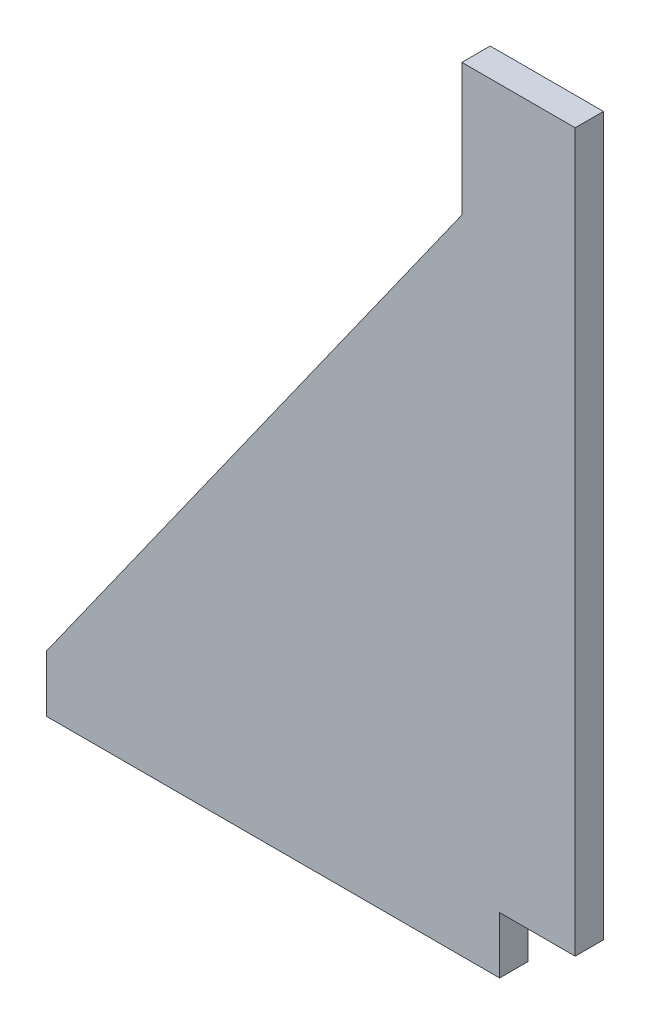
ISO-10303-21;
HEADER;
FILE_DESCRIPTION(('STEP AP214'),'2;1');
FILE_NAME('part.step','',(''),(''),'','','');
FILE_SCHEMA(('AUTOMOTIVE_DESIGN { 1 0 10303 214 1 1 1 1 }'));
ENDSEC;
DATA;
#1=APPLICATION_CONTEXT('core data for automotive mechanical design processes');
#2=APPLICATION_PROTOCOL_DEFINITION('international standard','automotive_design',2000,#1);
#3=PRODUCT_CONTEXT('',#1,'mechanical');
#4=PRODUCT('Part','Part','',(#3));
#5=PRODUCT_RELATED_PRODUCT_CATEGORY('part','',(#4));
#6=PRODUCT_DEFINITION_FORMATION('','',#4);
#7=PRODUCT_DEFINITION_CONTEXT('part definition',#1,'design');
#8=PRODUCT_DEFINITION('design','',#6,#7);
#9=PRODUCT_DEFINITION_SHAPE('','',#8);
#10=(LENGTH_UNIT() NAMED_UNIT(*) SI_UNIT(.MILLI.,.METRE.));
#11=(NAMED_UNIT(*) PLANE_ANGLE_UNIT() SI_UNIT($,.RADIAN.));
#12=(NAMED_UNIT(*) SI_UNIT($,.STERADIAN.) SOLID_ANGLE_UNIT());
#13=UNCERTAINTY_MEASURE_WITH_UNIT(LENGTH_MEASURE(1.E-05),#10,'distance_accuracy_value','');
#14=(GEOMETRIC_REPRESENTATION_CONTEXT(3) GLOBAL_UNCERTAINTY_ASSIGNED_CONTEXT((#13)) GLOBAL_UNIT_ASSIGNED_CONTEXT((#10,
#11,#12)) REPRESENTATION_CONTEXT('',''));
#15=CARTESIAN_POINT('',(0.,0.,0.));
#16=DIRECTION('',(0.,0.,1.));
#17=DIRECTION('',(1.,0.,0.));
#18=AXIS2_PLACEMENT_3D('',#15,#16,#17);
#19=CARTESIAN_POINT('',(0.,38.1,9.525));
#20=DIRECTION('',(-0.815507144735217,0.578747005941122,0.));
#21=DIRECTION('',(-0.578747005941122,-0.815507144735217,0.));
#22=AXIS2_PLACEMENT_3D('',#19,#20,#21);
#23=PLANE('',#22);
#24=DIRECTION('',(0.578747005941122,0.815507144735217,0.));
#25=VECTOR('',#24,1.);
#26=CARTESIAN_POINT('',(0.,38.1,-9.525));
#27=LINE('',#26,#25);
#28=CARTESIAN_POINT('',(0.,38.1,-9.525));
#29=VERTEX_POINT('',#28);
#30=CARTESIAN_POINT('',(279.4,431.8,-9.525));
#31=VERTEX_POINT('',#30);
#32=EDGE_CURVE('E139',#29,#31,#27,.T.);
#33=ORIENTED_EDGE('',*,*,#32,.F.);
#34=DIRECTION('',(0.,0.,-1.));
#35=VECTOR('',#34,1.);
#36=CARTESIAN_POINT('',(0.,38.1,9.525));
#37=LINE('',#36,#35);
#38=CARTESIAN_POINT('',(0.,38.1,9.525));
#39=VERTEX_POINT('',#38);
#40=EDGE_CURVE('E11',#39,#29,#37,.T.);
#41=ORIENTED_EDGE('',*,*,#40,.F.);
#42=DIRECTION('',(0.578747005941122,0.815507144735217,0.));
#43=VECTOR('',#42,1.);
#44=CARTESIAN_POINT('',(0.,38.1,9.525));
#45=LINE('',#44,#43);
#46=CARTESIAN_POINT('',(279.4,431.8,9.525));
#47=VERTEX_POINT('',#46);
#48=EDGE_CURVE('E156',#39,#47,#45,.T.);
#49=ORIENTED_EDGE('',*,*,#48,.T.);
#50=DIRECTION('',(0.,0.,-1.));
#51=VECTOR('',#50,1.);
#52=CARTESIAN_POINT('',(279.4,431.8,9.525));
#53=LINE('',#52,#51);
#54=EDGE_CURVE('E44',#47,#31,#53,.T.);
#55=ORIENTED_EDGE('',*,*,#54,.T.);
#56=EDGE_LOOP('',(#33,#41,#49,#55));
#57=FACE_BOUND('',#56,.T.);
#58=ADVANCED_FACE('F41',(#57),#23,.T.);
#59=CARTESIAN_POINT('',(0.,38.1,9.525));
#60=DIRECTION('',(1.,0.,0.));
#61=DIRECTION('',(0.,0.,-1.));
#62=AXIS2_PLACEMENT_3D('',#59,#60,#61);
#63=PLANE('',#62);
#64=DIRECTION('',(0.,-1.,0.));
#65=VECTOR('',#64,1.);
#66=CARTESIAN_POINT('',(0.,38.1,-9.525));
#67=LINE('',#66,#65);
#68=CARTESIAN_POINT('',(0.,0.,-9.525));
#69=VERTEX_POINT('',#68);
#70=EDGE_CURVE('E86',#29,#69,#67,.T.);
#71=ORIENTED_EDGE('',*,*,#70,.T.);
#72=DIRECTION('',(0.,0.,-1.));
#73=VECTOR('',#72,1.);
#74=CARTESIAN_POINT('',(0.,0.,9.525));
#75=LINE('',#74,#73);
#76=CARTESIAN_POINT('',(0.,0.,9.525));
#77=VERTEX_POINT('',#76);
#78=EDGE_CURVE('E50',#77,#69,#75,.T.);
#79=ORIENTED_EDGE('',*,*,#78,.F.);
#80=DIRECTION('',(0.,-1.,0.));
#81=VECTOR('',#80,1.);
#82=CARTESIAN_POINT('',(0.,38.1,9.525));
#83=LINE('',#82,#81);
#84=EDGE_CURVE('E117',#39,#77,#83,.T.);
#85=ORIENTED_EDGE('',*,*,#84,.F.);
#86=ORIENTED_EDGE('',*,*,#40,.T.);
#87=EDGE_LOOP('',(#71,#79,#85,#86));
#88=FACE_BOUND('',#87,.T.);
#89=ADVANCED_FACE('F197',(#88),#63,.F.);
#90=CARTESIAN_POINT('',(0.,0.,9.525));
#91=DIRECTION('',(0.,1.,0.));
#92=DIRECTION('',(0.,0.,1.));
#93=AXIS2_PLACEMENT_3D('',#90,#91,#92);
#94=PLANE('',#93);
#95=DIRECTION('',(1.,0.,0.));
#96=VECTOR('',#95,1.);
#97=CARTESIAN_POINT('',(0.,0.,-9.525));
#98=LINE('',#97,#96);
#99=CARTESIAN_POINT('',(304.8,0.,-9.525));
#100=VERTEX_POINT('',#99);
#101=EDGE_CURVE('E124',#69,#100,#98,.T.);
#102=ORIENTED_EDGE('',*,*,#101,.T.);
#103=DIRECTION('',(0.,0.,-1.));
#104=VECTOR('',#103,1.);
#105=CARTESIAN_POINT('',(304.8,0.,9.525));
#106=LINE('',#105,#104);
#107=CARTESIAN_POINT('',(304.8,0.,9.525));
#108=VERTEX_POINT('',#107);
#109=EDGE_CURVE('E121',#108,#100,#106,.T.);
#110=ORIENTED_EDGE('',*,*,#109,.F.);
#111=DIRECTION('',(1.,0.,0.));
#112=VECTOR('',#111,1.);
#113=CARTESIAN_POINT('',(0.,0.,9.525));
#114=LINE('',#113,#112);
#115=EDGE_CURVE('E110',#77,#108,#114,.T.);
#116=ORIENTED_EDGE('',*,*,#115,.F.);
#117=ORIENTED_EDGE('',*,*,#78,.T.);
#118=EDGE_LOOP('',(#102,#110,#116,#117));
#119=FACE_BOUND('',#118,.T.);
#120=ADVANCED_FACE('F122',(#119),#94,.F.);
#121=CARTESIAN_POINT('',(304.8,0.,9.525));
#122=DIRECTION('',(-1.,0.,0.));
#123=DIRECTION('',(0.,0.,1.));
#124=AXIS2_PLACEMENT_3D('',#121,#122,#123);
#125=PLANE('',#124);
#126=DIRECTION('',(0.,1.,0.));
#127=VECTOR('',#126,1.);
#128=CARTESIAN_POINT('',(304.8,0.,-9.525));
#129=LINE('',#128,#127);
#130=CARTESIAN_POINT('',(304.8,38.1,-9.525));
#131=VERTEX_POINT('',#130);
#132=EDGE_CURVE('E153',#100,#131,#129,.T.);
#133=ORIENTED_EDGE('',*,*,#132,.T.);
#134=DIRECTION('',(0.,0.,-1.));
#135=VECTOR('',#134,1.);
#136=CARTESIAN_POINT('',(304.8,38.1,9.525));
#137=LINE('',#136,#135);
#138=CARTESIAN_POINT('',(304.8,38.1,9.525));
#139=VERTEX_POINT('',#138);
#140=EDGE_CURVE('E127',#139,#131,#137,.T.);
#141=ORIENTED_EDGE('',*,*,#140,.F.);
#142=DIRECTION('',(0.,1.,0.));
#143=VECTOR('',#142,1.);
#144=CARTESIAN_POINT('',(304.8,0.,9.525));
#145=LINE('',#144,#143);
#146=EDGE_CURVE('E115',#108,#139,#145,.T.);
#147=ORIENTED_EDGE('',*,*,#146,.F.);
#148=ORIENTED_EDGE('',*,*,#109,.T.);
#149=EDGE_LOOP('',(#133,#141,#147,#148));
#150=FACE_BOUND('',#149,.T.);
#151=ADVANCED_FACE('F129',(#150),#125,.F.);
#152=CARTESIAN_POINT('',(304.8,38.1,9.525));
#153=DIRECTION('',(0.,1.,0.));
#154=DIRECTION('',(0.,0.,1.));
#155=AXIS2_PLACEMENT_3D('',#152,#153,#154);
#156=PLANE('',#155);
#157=DIRECTION('',(1.,0.,0.));
#158=VECTOR('',#157,1.);
#159=CARTESIAN_POINT('',(304.8,38.1,-9.525));
#160=LINE('',#159,#158);
#161=CARTESIAN_POINT('',(355.6,38.1,-9.525));
#162=VERTEX_POINT('',#161);
#163=EDGE_CURVE('E151',#131,#162,#160,.T.);
#164=ORIENTED_EDGE('',*,*,#163,.T.);
#165=DIRECTION('',(0.,0.,-1.));
#166=VECTOR('',#165,1.);
#167=CARTESIAN_POINT('',(355.6,38.1,9.525));
#168=LINE('',#167,#166);
#169=CARTESIAN_POINT('',(355.6,38.1,9.525));
#170=VERTEX_POINT('',#169);
#171=EDGE_CURVE('E160',#170,#162,#168,.T.);
#172=ORIENTED_EDGE('',*,*,#171,.F.);
#173=DIRECTION('',(1.,0.,0.));
#174=VECTOR('',#173,1.);
#175=CARTESIAN_POINT('',(304.8,38.1,9.525));
#176=LINE('',#175,#174);
#177=EDGE_CURVE('E132',#139,#170,#176,.T.);
#178=ORIENTED_EDGE('',*,*,#177,.F.);
#179=ORIENTED_EDGE('',*,*,#140,.T.);
#180=EDGE_LOOP('',(#164,#172,#178,#179));
#181=FACE_BOUND('',#180,.T.);
#182=ADVANCED_FACE('F174',(#181),#156,.F.);
#183=CARTESIAN_POINT('',(355.6,38.1,9.525));
#184=DIRECTION('',(-1.,0.,0.));
#185=DIRECTION('',(0.,0.,1.));
#186=AXIS2_PLACEMENT_3D('',#183,#184,#185);
#187=PLANE('',#186);
#188=DIRECTION('',(0.,1.,0.));
#189=VECTOR('',#188,1.);
#190=CARTESIAN_POINT('',(355.6,38.1,-9.525));
#191=LINE('',#190,#189);
#192=CARTESIAN_POINT('',(355.6,520.7,-9.525));
#193=VERTEX_POINT('',#192);
#194=EDGE_CURVE('E148',#162,#193,#191,.T.);
#195=ORIENTED_EDGE('',*,*,#194,.T.);
#196=DIRECTION('',(0.,0.,-1.));
#197=VECTOR('',#196,1.);
#198=CARTESIAN_POINT('',(355.6,520.7,9.525));
#199=LINE('',#198,#197);
#200=CARTESIAN_POINT('',(355.6,520.7,9.525));
#201=VERTEX_POINT('',#200);
#202=EDGE_CURVE('E163',#201,#193,#199,.T.);
#203=ORIENTED_EDGE('',*,*,#202,.F.);
#204=DIRECTION('',(0.,1.,0.));
#205=VECTOR('',#204,1.);
#206=CARTESIAN_POINT('',(355.6,38.1,9.525));
#207=LINE('',#206,#205);
#208=EDGE_CURVE('E134',#170,#201,#207,.T.);
#209=ORIENTED_EDGE('',*,*,#208,.F.);
#210=ORIENTED_EDGE('',*,*,#171,.T.);
#211=EDGE_LOOP('',(#195,#203,#209,#210));
#212=FACE_BOUND('',#211,.T.);
#213=ADVANCED_FACE('F182',(#212),#187,.F.);
#214=CARTESIAN_POINT('',(355.6,520.7,9.525));
#215=DIRECTION('',(0.,-1.,0.));
#216=DIRECTION('',(0.,0.,-1.));
#217=AXIS2_PLACEMENT_3D('',#214,#215,#216);
#218=PLANE('',#217);
#219=DIRECTION('',(-1.,0.,0.));
#220=VECTOR('',#219,1.);
#221=CARTESIAN_POINT('',(355.6,520.7,-9.525));
#222=LINE('',#221,#220);
#223=CARTESIAN_POINT('',(279.4,520.7,-9.525));
#224=VERTEX_POINT('',#223);
#225=EDGE_CURVE('E145',#193,#224,#222,.T.);
#226=ORIENTED_EDGE('',*,*,#225,.T.);
#227=DIRECTION('',(0.,0.,-1.));
#228=VECTOR('',#227,1.);
#229=CARTESIAN_POINT('',(279.4,520.7,9.525));
#230=LINE('',#229,#228);
#231=CARTESIAN_POINT('',(279.4,520.7,9.525));
#232=VERTEX_POINT('',#231);
#233=EDGE_CURVE('E165',#232,#224,#230,.T.);
#234=ORIENTED_EDGE('',*,*,#233,.F.);
#235=DIRECTION('',(-1.,0.,0.));
#236=VECTOR('',#235,1.);
#237=CARTESIAN_POINT('',(355.6,520.7,9.525));
#238=LINE('',#237,#236);
#239=EDGE_CURVE('E179',#201,#232,#238,.T.);
#240=ORIENTED_EDGE('',*,*,#239,.F.);
#241=ORIENTED_EDGE('',*,*,#202,.T.);
#242=EDGE_LOOP('',(#226,#234,#240,#241));
#243=FACE_BOUND('',#242,.T.);
#244=ADVANCED_FACE('F184',(#243),#218,.F.);
#245=CARTESIAN_POINT('',(279.4,431.8,9.525));
#246=DIRECTION('',(-1.,0.,0.));
#247=DIRECTION('',(0.,0.,1.));
#248=AXIS2_PLACEMENT_3D('',#245,#246,#247);
#249=PLANE('',#248);
#250=DIRECTION('',(0.,1.,0.));
#251=VECTOR('',#250,1.);
#252=CARTESIAN_POINT('',(279.4,431.8,-9.525));
#253=LINE('',#252,#251);
#254=EDGE_CURVE('E142',#31,#224,#253,.T.);
#255=ORIENTED_EDGE('',*,*,#254,.F.);
#256=ORIENTED_EDGE('',*,*,#54,.F.);
#257=DIRECTION('',(0.,1.,0.));
#258=VECTOR('',#257,1.);
#259=CARTESIAN_POINT('',(279.4,431.8,9.525));
#260=LINE('',#259,#258);
#261=EDGE_CURVE('E185',#47,#232,#260,.T.);
#262=ORIENTED_EDGE('',*,*,#261,.T.);
#263=ORIENTED_EDGE('',*,*,#233,.T.);
#264=EDGE_LOOP('',(#255,#256,#262,#263));
#265=FACE_BOUND('',#264,.T.);
#266=ADVANCED_FACE('F167',(#265),#249,.T.);
#267=CARTESIAN_POINT('',(0.,0.,9.525));
#268=DIRECTION('',(0.,0.,1.));
#269=DIRECTION('',(1.,0.,0.));
#270=AXIS2_PLACEMENT_3D('',#267,#268,#269);
#271=PLANE('',#270);
#272=ORIENTED_EDGE('',*,*,#48,.F.);
#273=ORIENTED_EDGE('',*,*,#84,.T.);
#274=ORIENTED_EDGE('',*,*,#115,.T.);
#275=ORIENTED_EDGE('',*,*,#146,.T.);
#276=ORIENTED_EDGE('',*,*,#177,.T.);
#277=ORIENTED_EDGE('',*,*,#208,.T.);
#278=ORIENTED_EDGE('',*,*,#239,.T.);
#279=ORIENTED_EDGE('',*,*,#261,.F.);
#280=EDGE_LOOP('',(#272,#273,#274,#275,#276,#277,#278,#279));
#281=FACE_BOUND('',#280,.T.);
#282=ADVANCED_FACE('F113',(#281),#271,.T.);
#283=CARTESIAN_POINT('',(0.,0.,-9.525));
#284=DIRECTION('',(0.,0.,1.));
#285=DIRECTION('',(1.,0.,0.));
#286=AXIS2_PLACEMENT_3D('',#283,#284,#285);
#287=PLANE('',#286);
#288=ORIENTED_EDGE('',*,*,#32,.T.);
#289=ORIENTED_EDGE('',*,*,#254,.T.);
#290=ORIENTED_EDGE('',*,*,#225,.F.);
#291=ORIENTED_EDGE('',*,*,#194,.F.);
#292=ORIENTED_EDGE('',*,*,#163,.F.);
#293=ORIENTED_EDGE('',*,*,#132,.F.);
#294=ORIENTED_EDGE('',*,*,#101,.F.);
#295=ORIENTED_EDGE('',*,*,#70,.F.);
#296=EDGE_LOOP('',(#288,#289,#290,#291,#292,#293,#294,#295));
#297=FACE_BOUND('',#296,.T.);
#298=ADVANCED_FACE('F170',(#297),#287,.F.);
#299=CLOSED_SHELL('',(#58,#89,#120,#151,#182,#213,#244,#266,#282,#298));
#300=MANIFOLD_SOLID_BREP('B2',#299);
#301=ADVANCED_BREP_SHAPE_REPRESENTATION('',(#18,#300),#14);
#302=SHAPE_DEFINITION_REPRESENTATION(#9,#301);
ENDSEC;
END-ISO-10303-21;
